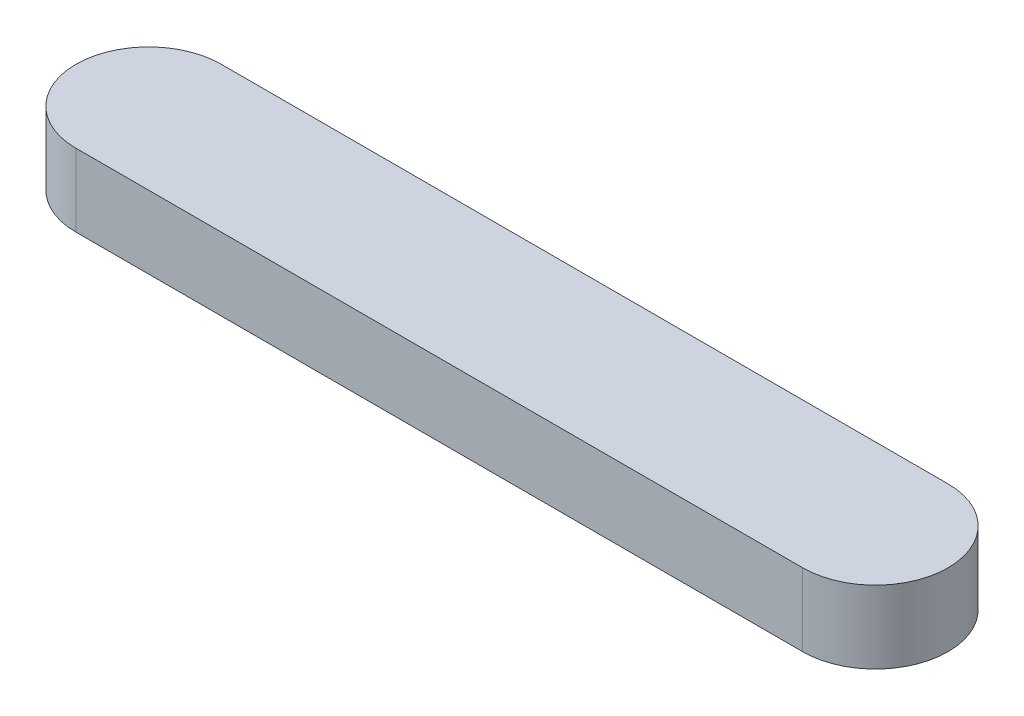
ISO-10303-21;
HEADER;
FILE_DESCRIPTION(('STEP AP214'),'2;1');
FILE_NAME('part.step','',(''),(''),'','','');
FILE_SCHEMA(('AUTOMOTIVE_DESIGN { 1 0 10303 214 1 1 1 1 }'));
ENDSEC;
DATA;
#1=APPLICATION_CONTEXT('core data for automotive mechanical design processes');
#2=APPLICATION_PROTOCOL_DEFINITION('international standard','automotive_design',2000,#1);
#3=PRODUCT_CONTEXT('',#1,'mechanical');
#4=PRODUCT('Part','Part','',(#3));
#5=PRODUCT_RELATED_PRODUCT_CATEGORY('part','',(#4));
#6=PRODUCT_DEFINITION_FORMATION('','',#4);
#7=PRODUCT_DEFINITION_CONTEXT('part definition',#1,'design');
#8=PRODUCT_DEFINITION('design','',#6,#7);
#9=PRODUCT_DEFINITION_SHAPE('','',#8);
#10=(LENGTH_UNIT() NAMED_UNIT(*) SI_UNIT(.MILLI.,.METRE.));
#11=(NAMED_UNIT(*) PLANE_ANGLE_UNIT() SI_UNIT($,.RADIAN.));
#12=(NAMED_UNIT(*) SI_UNIT($,.STERADIAN.) SOLID_ANGLE_UNIT());
#13=UNCERTAINTY_MEASURE_WITH_UNIT(LENGTH_MEASURE(1.E-05),#10,'distance_accuracy_value','');
#14=(GEOMETRIC_REPRESENTATION_CONTEXT(3) GLOBAL_UNCERTAINTY_ASSIGNED_CONTEXT((#13)) GLOBAL_UNIT_ASSIGNED_CONTEXT((#10,
#11,#12)) REPRESENTATION_CONTEXT('',''));
#15=CARTESIAN_POINT('',(0.,0.,0.));
#16=DIRECTION('',(0.,0.,1.));
#17=DIRECTION('',(1.,0.,0.));
#18=AXIS2_PLACEMENT_3D('',#15,#16,#17);
#19=CARTESIAN_POINT('',(0.,2.54,0.));
#20=DIRECTION('',(0.,-1.,0.));
#21=DIRECTION('',(0.,0.,-1.));
#22=AXIS2_PLACEMENT_3D('',#19,#20,#21);
#23=CYLINDRICAL_SURFACE('',#22,2.54);
#24=CARTESIAN_POINT('',(0.,0.,0.));
#25=DIRECTION('',(0.,1.,0.));
#26=DIRECTION('',(0.,0.,1.));
#27=AXIS2_PLACEMENT_3D('',#24,#25,#26);
#28=CIRCLE('',#27,2.54);
#29=CARTESIAN_POINT('',(0.,0.,-2.54));
#30=VERTEX_POINT('',#29);
#31=CARTESIAN_POINT('',(0.,0.,2.54));
#32=VERTEX_POINT('',#31);
#33=EDGE_CURVE('E96',#30,#32,#28,.T.);
#34=ORIENTED_EDGE('',*,*,#33,.T.);
#35=DIRECTION('',(0.,-1.,0.));
#36=VECTOR('',#35,1.);
#37=CARTESIAN_POINT('',(0.,2.54,2.54));
#38=LINE('',#37,#36);
#39=CARTESIAN_POINT('',(0.,2.54,2.54));
#40=VERTEX_POINT('',#39);
#41=EDGE_CURVE('E11',#40,#32,#38,.T.);
#42=ORIENTED_EDGE('',*,*,#41,.F.);
#43=CARTESIAN_POINT('',(0.,2.54,0.));
#44=DIRECTION('',(0.,1.,0.));
#45=DIRECTION('',(0.,0.,1.));
#46=AXIS2_PLACEMENT_3D('',#43,#44,#45);
#47=CIRCLE('',#46,2.54);
#48=CARTESIAN_POINT('',(0.,2.54,-2.54));
#49=VERTEX_POINT('',#48);
#50=EDGE_CURVE('E84',#49,#40,#47,.T.);
#51=ORIENTED_EDGE('',*,*,#50,.F.);
#52=DIRECTION('',(0.,-1.,0.));
#53=VECTOR('',#52,1.);
#54=CARTESIAN_POINT('',(0.,2.54,-2.54));
#55=LINE('',#54,#53);
#56=EDGE_CURVE('E92',#49,#30,#55,.T.);
#57=ORIENTED_EDGE('',*,*,#56,.T.);
#58=EDGE_LOOP('',(#34,#42,#51,#57));
#59=FACE_BOUND('',#58,.T.);
#60=ADVANCED_FACE('F33',(#59),#23,.T.);
#61=CARTESIAN_POINT('',(0.,2.54,2.54));
#62=DIRECTION('',(0.,0.,-1.));
#63=DIRECTION('',(-1.,0.,0.));
#64=AXIS2_PLACEMENT_3D('',#61,#62,#63);
#65=PLANE('',#64);
#66=DIRECTION('',(1.,0.,0.));
#67=VECTOR('',#66,1.);
#68=CARTESIAN_POINT('',(0.,0.,2.54));
#69=LINE('',#68,#67);
#70=CARTESIAN_POINT('',(25.4,0.,2.54));
#71=VERTEX_POINT('',#70);
#72=EDGE_CURVE('E88',#32,#71,#69,.T.);
#73=ORIENTED_EDGE('',*,*,#72,.T.);
#74=DIRECTION('',(0.,-1.,0.));
#75=VECTOR('',#74,1.);
#76=CARTESIAN_POINT('',(25.4,2.54,2.54));
#77=LINE('',#76,#75);
#78=CARTESIAN_POINT('',(25.4,2.54,2.54));
#79=VERTEX_POINT('',#78);
#80=EDGE_CURVE('E41',#79,#71,#77,.T.);
#81=ORIENTED_EDGE('',*,*,#80,.F.);
#82=DIRECTION('',(1.,0.,0.));
#83=VECTOR('',#82,1.);
#84=CARTESIAN_POINT('',(0.,2.54,2.54));
#85=LINE('',#84,#83);
#86=EDGE_CURVE('E79',#40,#79,#85,.T.);
#87=ORIENTED_EDGE('',*,*,#86,.F.);
#88=ORIENTED_EDGE('',*,*,#41,.T.);
#89=EDGE_LOOP('',(#73,#81,#87,#88));
#90=FACE_BOUND('',#89,.T.);
#91=ADVANCED_FACE('F87',(#90),#65,.F.);
#92=CARTESIAN_POINT('',(25.4,2.54,0.));
#93=DIRECTION('',(0.,-1.,0.));
#94=DIRECTION('',(0.,0.,-1.));
#95=AXIS2_PLACEMENT_3D('',#92,#93,#94);
#96=CYLINDRICAL_SURFACE('',#95,2.54);
#97=CARTESIAN_POINT('',(25.4,0.,0.));
#98=DIRECTION('',(0.,1.,0.));
#99=DIRECTION('',(0.,0.,1.));
#100=AXIS2_PLACEMENT_3D('',#97,#98,#99);
#101=CIRCLE('',#100,2.54);
#102=CARTESIAN_POINT('',(25.4,0.,-2.54));
#103=VERTEX_POINT('',#102);
#104=EDGE_CURVE('E66',#71,#103,#101,.T.);
#105=ORIENTED_EDGE('',*,*,#104,.T.);
#106=DIRECTION('',(0.,-1.,0.));
#107=VECTOR('',#106,1.);
#108=CARTESIAN_POINT('',(25.4,2.54,-2.54));
#109=LINE('',#108,#107);
#110=CARTESIAN_POINT('',(25.4,2.54,-2.54));
#111=VERTEX_POINT('',#110);
#112=EDGE_CURVE('E89',#111,#103,#109,.T.);
#113=ORIENTED_EDGE('',*,*,#112,.F.);
#114=CARTESIAN_POINT('',(25.4,2.54,0.));
#115=DIRECTION('',(0.,1.,0.));
#116=DIRECTION('',(0.,0.,1.));
#117=AXIS2_PLACEMENT_3D('',#114,#115,#116);
#118=CIRCLE('',#117,2.54);
#119=EDGE_CURVE('E82',#79,#111,#118,.T.);
#120=ORIENTED_EDGE('',*,*,#119,.F.);
#121=ORIENTED_EDGE('',*,*,#80,.T.);
#122=EDGE_LOOP('',(#105,#113,#120,#121));
#123=FACE_BOUND('',#122,.T.);
#124=ADVANCED_FACE('F90',(#123),#96,.T.);
#125=CARTESIAN_POINT('',(0.,2.54,-2.54));
#126=DIRECTION('',(0.,0.,1.));
#127=DIRECTION('',(1.,0.,0.));
#128=AXIS2_PLACEMENT_3D('',#125,#126,#127);
#129=PLANE('',#128);
#130=DIRECTION('',(-1.,0.,0.));
#131=VECTOR('',#130,1.);
#132=CARTESIAN_POINT('',(0.,0.,-2.54));
#133=LINE('',#132,#131);
#134=EDGE_CURVE('E72',#103,#30,#133,.T.);
#135=ORIENTED_EDGE('',*,*,#134,.T.);
#136=ORIENTED_EDGE('',*,*,#56,.F.);
#137=DIRECTION('',(-1.,0.,0.));
#138=VECTOR('',#137,1.);
#139=CARTESIAN_POINT('',(0.,2.54,-2.54));
#140=LINE('',#139,#138);
#141=EDGE_CURVE('E49',#111,#49,#140,.T.);
#142=ORIENTED_EDGE('',*,*,#141,.F.);
#143=ORIENTED_EDGE('',*,*,#112,.T.);
#144=EDGE_LOOP('',(#135,#136,#142,#143));
#145=FACE_BOUND('',#144,.T.);
#146=ADVANCED_FACE('F103',(#145),#129,.F.);
#147=CARTESIAN_POINT('',(0.,2.54,0.));
#148=DIRECTION('',(0.,1.,0.));
#149=DIRECTION('',(0.,0.,1.));
#150=AXIS2_PLACEMENT_3D('',#147,#148,#149);
#151=PLANE('',#150);
#152=ORIENTED_EDGE('',*,*,#50,.T.);
#153=ORIENTED_EDGE('',*,*,#86,.T.);
#154=ORIENTED_EDGE('',*,*,#119,.T.);
#155=ORIENTED_EDGE('',*,*,#141,.T.);
#156=EDGE_LOOP('',(#152,#153,#154,#155));
#157=FACE_BOUND('',#156,.T.);
#158=ADVANCED_FACE('F80',(#157),#151,.T.);
#159=CARTESIAN_POINT('',(0.,0.,0.));
#160=DIRECTION('',(0.,1.,0.));
#161=DIRECTION('',(0.,0.,1.));
#162=AXIS2_PLACEMENT_3D('',#159,#160,#161);
#163=PLANE('',#162);
#164=ORIENTED_EDGE('',*,*,#33,.F.);
#165=ORIENTED_EDGE('',*,*,#134,.F.);
#166=ORIENTED_EDGE('',*,*,#104,.F.);
#167=ORIENTED_EDGE('',*,*,#72,.F.);
#168=EDGE_LOOP('',(#164,#165,#166,#167));
#169=FACE_BOUND('',#168,.T.);
#170=ADVANCED_FACE('F106',(#169),#163,.F.);
#171=CLOSED_SHELL('',(#60,#91,#124,#146,#158,#170));
#172=MANIFOLD_SOLID_BREP('B2',#171);
#173=ADVANCED_BREP_SHAPE_REPRESENTATION('',(#18,#172),#14);
#174=SHAPE_DEFINITION_REPRESENTATION(#9,#173);
ENDSEC;
END-ISO-10303-21;
